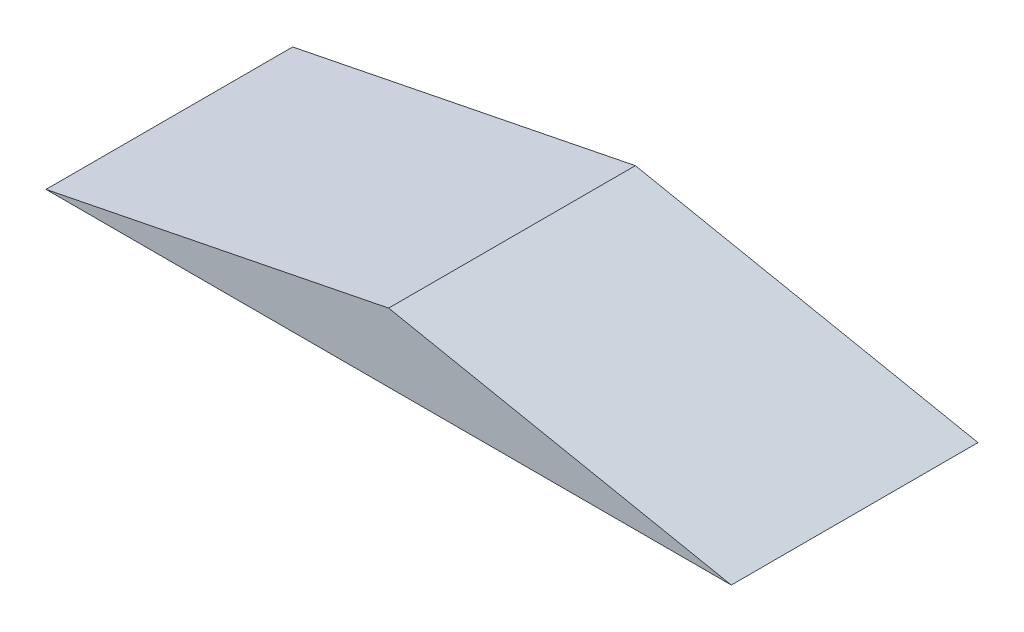
ISO-10303-21;
HEADER;
FILE_DESCRIPTION(('STEP AP214'),'2;1');
FILE_NAME('part.step','',(''),(''),'','','');
FILE_SCHEMA(('AUTOMOTIVE_DESIGN { 1 0 10303 214 1 1 1 1 }'));
ENDSEC;
DATA;
#1=APPLICATION_CONTEXT('core data for automotive mechanical design processes');
#2=APPLICATION_PROTOCOL_DEFINITION('international standard','automotive_design',2000,#1);
#3=PRODUCT_CONTEXT('',#1,'mechanical');
#4=PRODUCT('Part','Part','',(#3));
#5=PRODUCT_RELATED_PRODUCT_CATEGORY('part','',(#4));
#6=PRODUCT_DEFINITION_FORMATION('','',#4);
#7=PRODUCT_DEFINITION_CONTEXT('part definition',#1,'design');
#8=PRODUCT_DEFINITION('design','',#6,#7);
#9=PRODUCT_DEFINITION_SHAPE('','',#8);
#10=(LENGTH_UNIT() NAMED_UNIT(*) SI_UNIT(.MILLI.,.METRE.));
#11=(NAMED_UNIT(*) PLANE_ANGLE_UNIT() SI_UNIT($,.RADIAN.));
#12=(NAMED_UNIT(*) SI_UNIT($,.STERADIAN.) SOLID_ANGLE_UNIT());
#13=UNCERTAINTY_MEASURE_WITH_UNIT(LENGTH_MEASURE(1.E-05),#10,'distance_accuracy_value','');
#14=(GEOMETRIC_REPRESENTATION_CONTEXT(3) GLOBAL_UNCERTAINTY_ASSIGNED_CONTEXT((#13)) GLOBAL_UNIT_ASSIGNED_CONTEXT((#10,
#11,#12)) REPRESENTATION_CONTEXT('',''));
#15=CARTESIAN_POINT('',(0.,0.,0.));
#16=DIRECTION('',(0.,0.,1.));
#17=DIRECTION('',(1.,0.,0.));
#18=AXIS2_PLACEMENT_3D('',#15,#16,#17);
#19=CARTESIAN_POINT('',(0.,0.,1800.));
#20=DIRECTION('',(0.196116135138184,-0.98058067569092,0.));
#21=DIRECTION('',(0.98058067569092,0.196116135138184,0.));
#22=AXIS2_PLACEMENT_3D('',#19,#20,#21);
#23=PLANE('',#22);
#24=DIRECTION('',(-0.98058067569092,-0.196116135138184,0.));
#25=VECTOR('',#24,1.);
#26=CARTESIAN_POINT('',(0.,0.,0.));
#27=LINE('',#26,#25);
#28=CARTESIAN_POINT('',(2500.,500.,0.));
#29=VERTEX_POINT('',#28);
#30=CARTESIAN_POINT('',(0.,0.,0.));
#31=VERTEX_POINT('',#30);
#32=EDGE_CURVE('E92',#29,#31,#27,.T.);
#33=ORIENTED_EDGE('',*,*,#32,.T.);
#34=DIRECTION('',(0.,0.,-1.));
#35=VECTOR('',#34,1.);
#36=CARTESIAN_POINT('',(0.,0.,1800.));
#37=LINE('',#36,#35);
#38=CARTESIAN_POINT('',(0.,0.,1800.));
#39=VERTEX_POINT('',#38);
#40=EDGE_CURVE('E11',#39,#31,#37,.T.);
#41=ORIENTED_EDGE('',*,*,#40,.F.);
#42=DIRECTION('',(-0.98058067569092,-0.196116135138184,0.));
#43=VECTOR('',#42,1.);
#44=CARTESIAN_POINT('',(0.,0.,1800.));
#45=LINE('',#44,#43);
#46=CARTESIAN_POINT('',(2500.,500.,1800.));
#47=VERTEX_POINT('',#46);
#48=EDGE_CURVE('E85',#47,#39,#45,.T.);
#49=ORIENTED_EDGE('',*,*,#48,.F.);
#50=DIRECTION('',(0.,0.,-1.));
#51=VECTOR('',#50,1.);
#52=CARTESIAN_POINT('',(2500.,500.,1800.));
#53=LINE('',#52,#51);
#54=EDGE_CURVE('E93',#47,#29,#53,.T.);
#55=ORIENTED_EDGE('',*,*,#54,.T.);
#56=EDGE_LOOP('',(#33,#41,#49,#55));
#57=FACE_BOUND('',#56,.T.);
#58=ADVANCED_FACE('F45',(#57),#23,.F.);
#59=CARTESIAN_POINT('',(0.,0.,1800.));
#60=DIRECTION('',(0.,1.,0.));
#61=DIRECTION('',(0.,0.,1.));
#62=AXIS2_PLACEMENT_3D('',#59,#60,#61);
#63=PLANE('',#62);
#64=DIRECTION('',(1.,0.,0.));
#65=VECTOR('',#64,1.);
#66=CARTESIAN_POINT('',(0.,0.,0.));
#67=LINE('',#66,#65);
#68=CARTESIAN_POINT('',(5000.,0.,0.));
#69=VERTEX_POINT('',#68);
#70=EDGE_CURVE('E73',#31,#69,#67,.T.);
#71=ORIENTED_EDGE('',*,*,#70,.T.);
#72=DIRECTION('',(0.,0.,-1.));
#73=VECTOR('',#72,1.);
#74=CARTESIAN_POINT('',(5000.,0.,1800.));
#75=LINE('',#74,#73);
#76=CARTESIAN_POINT('',(5000.,0.,1800.));
#77=VERTEX_POINT('',#76);
#78=EDGE_CURVE('E53',#77,#69,#75,.T.);
#79=ORIENTED_EDGE('',*,*,#78,.F.);
#80=DIRECTION('',(1.,0.,0.));
#81=VECTOR('',#80,1.);
#82=CARTESIAN_POINT('',(0.,0.,1800.));
#83=LINE('',#82,#81);
#84=EDGE_CURVE('E81',#39,#77,#83,.T.);
#85=ORIENTED_EDGE('',*,*,#84,.F.);
#86=ORIENTED_EDGE('',*,*,#40,.T.);
#87=EDGE_LOOP('',(#71,#79,#85,#86));
#88=FACE_BOUND('',#87,.T.);
#89=ADVANCED_FACE('F82',(#88),#63,.F.);
#90=CARTESIAN_POINT('',(2500.,500.,1800.));
#91=DIRECTION('',(-0.196116135138184,-0.98058067569092,0.));
#92=DIRECTION('',(0.98058067569092,-0.196116135138184,0.));
#93=AXIS2_PLACEMENT_3D('',#90,#91,#92);
#94=PLANE('',#93);
#95=DIRECTION('',(-0.98058067569092,0.196116135138184,0.));
#96=VECTOR('',#95,1.);
#97=CARTESIAN_POINT('',(2500.,500.,0.));
#98=LINE('',#97,#96);
#99=EDGE_CURVE('E78',#69,#29,#98,.T.);
#100=ORIENTED_EDGE('',*,*,#99,.T.);
#101=ORIENTED_EDGE('',*,*,#54,.F.);
#102=DIRECTION('',(-0.98058067569092,0.196116135138184,0.));
#103=VECTOR('',#102,1.);
#104=CARTESIAN_POINT('',(2500.,500.,1800.));
#105=LINE('',#104,#103);
#106=EDGE_CURVE('E61',#77,#47,#105,.T.);
#107=ORIENTED_EDGE('',*,*,#106,.F.);
#108=ORIENTED_EDGE('',*,*,#78,.T.);
#109=EDGE_LOOP('',(#100,#101,#107,#108));
#110=FACE_BOUND('',#109,.T.);
#111=ADVANCED_FACE('F100',(#110),#94,.F.);
#112=CARTESIAN_POINT('',(0.,0.,1800.));
#113=DIRECTION('',(0.,0.,-1.));
#114=DIRECTION('',(-1.,0.,0.));
#115=AXIS2_PLACEMENT_3D('',#112,#113,#114);
#116=PLANE('',#115);
#117=ORIENTED_EDGE('',*,*,#48,.T.);
#118=ORIENTED_EDGE('',*,*,#84,.T.);
#119=ORIENTED_EDGE('',*,*,#106,.T.);
#120=EDGE_LOOP('',(#117,#118,#119));
#121=FACE_BOUND('',#120,.T.);
#122=ADVANCED_FACE('F88',(#121),#116,.F.);
#123=CARTESIAN_POINT('',(0.,0.,0.));
#124=DIRECTION('',(0.,0.,-1.));
#125=DIRECTION('',(-1.,0.,0.));
#126=AXIS2_PLACEMENT_3D('',#123,#124,#125);
#127=PLANE('',#126);
#128=ORIENTED_EDGE('',*,*,#32,.F.);
#129=ORIENTED_EDGE('',*,*,#99,.F.);
#130=ORIENTED_EDGE('',*,*,#70,.F.);
#131=EDGE_LOOP('',(#128,#129,#130));
#132=FACE_BOUND('',#131,.T.);
#133=ADVANCED_FACE('F101',(#132),#127,.T.);
#134=CLOSED_SHELL('',(#58,#89,#111,#122,#133));
#135=MANIFOLD_SOLID_BREP('B2',#134);
#136=ADVANCED_BREP_SHAPE_REPRESENTATION('',(#18,#135),#14);
#137=SHAPE_DEFINITION_REPRESENTATION(#9,#136);
ENDSEC;
END-ISO-10303-21;
